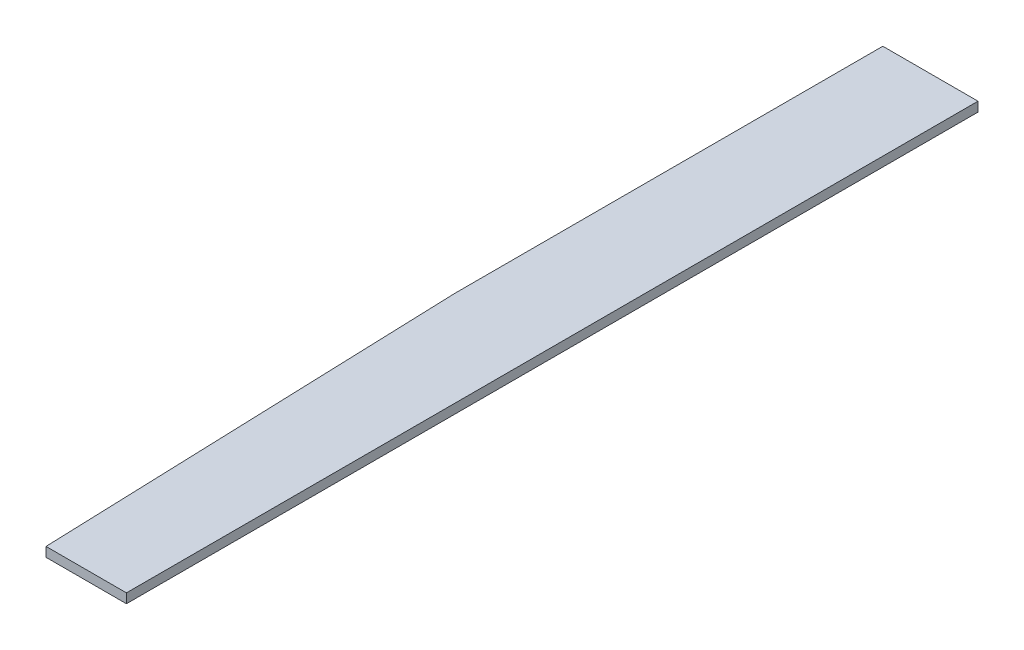
ISO-10303-21;
HEADER;
FILE_DESCRIPTION(('STEP AP214'),'2;1');
FILE_NAME('part.step','',(''),(''),'','','');
FILE_SCHEMA(('AUTOMOTIVE_DESIGN { 1 0 10303 214 1 1 1 1 }'));
ENDSEC;
DATA;
#1=APPLICATION_CONTEXT('core data for automotive mechanical design processes');
#2=APPLICATION_PROTOCOL_DEFINITION('international standard','automotive_design',2000,#1);
#3=PRODUCT_CONTEXT('',#1,'mechanical');
#4=PRODUCT('Part','Part','',(#3));
#5=PRODUCT_RELATED_PRODUCT_CATEGORY('part','',(#4));
#6=PRODUCT_DEFINITION_FORMATION('','',#4);
#7=PRODUCT_DEFINITION_CONTEXT('part definition',#1,'design');
#8=PRODUCT_DEFINITION('design','',#6,#7);
#9=PRODUCT_DEFINITION_SHAPE('','',#8);
#10=(LENGTH_UNIT() NAMED_UNIT(*) SI_UNIT(.MILLI.,.METRE.));
#11=(NAMED_UNIT(*) PLANE_ANGLE_UNIT() SI_UNIT($,.RADIAN.));
#12=(NAMED_UNIT(*) SI_UNIT($,.STERADIAN.) SOLID_ANGLE_UNIT());
#13=UNCERTAINTY_MEASURE_WITH_UNIT(LENGTH_MEASURE(1.E-05),#10,'distance_accuracy_value','');
#14=(GEOMETRIC_REPRESENTATION_CONTEXT(3) GLOBAL_UNCERTAINTY_ASSIGNED_CONTEXT((#13)) GLOBAL_UNIT_ASSIGNED_CONTEXT((#10,
#11,#12)) REPRESENTATION_CONTEXT('',''));
#15=CARTESIAN_POINT('',(0.,0.,0.));
#16=DIRECTION('',(0.,0.,1.));
#17=DIRECTION('',(1.,0.,0.));
#18=AXIS2_PLACEMENT_3D('',#15,#16,#17);
#19=CARTESIAN_POINT('',(0.,5.,0.));
#20=DIRECTION('',(-1.,0.,0.));
#21=DIRECTION('',(0.,0.,1.));
#22=AXIS2_PLACEMENT_3D('',#19,#20,#21);
#23=PLANE('',#22);
#24=DIRECTION('',(0.,0.,-1.));
#25=VECTOR('',#24,1.);
#26=CARTESIAN_POINT('',(0.,0.,0.));
#27=LINE('',#26,#25);
#28=CARTESIAN_POINT('',(0.,0.,0.));
#29=VERTEX_POINT('',#28);
#30=CARTESIAN_POINT('',(0.,0.,-450.));
#31=VERTEX_POINT('',#30);
#32=EDGE_CURVE('E124',#29,#31,#27,.T.);
#33=ORIENTED_EDGE('',*,*,#32,.T.);
#34=DIRECTION('',(0.,-1.,0.));
#35=VECTOR('',#34,1.);
#36=CARTESIAN_POINT('',(0.,5.,-450.));
#37=LINE('',#36,#35);
#38=CARTESIAN_POINT('',(0.,5.,-450.));
#39=VERTEX_POINT('',#38);
#40=EDGE_CURVE('E11',#39,#31,#37,.T.);
#41=ORIENTED_EDGE('',*,*,#40,.F.);
#42=DIRECTION('',(0.,0.,-1.));
#43=VECTOR('',#42,1.);
#44=CARTESIAN_POINT('',(0.,5.,0.));
#45=LINE('',#44,#43);
#46=CARTESIAN_POINT('',(0.,5.,0.));
#47=VERTEX_POINT('',#46);
#48=EDGE_CURVE('E137',#47,#39,#45,.T.);
#49=ORIENTED_EDGE('',*,*,#48,.F.);
#50=DIRECTION('',(0.,-1.,0.));
#51=VECTOR('',#50,1.);
#52=CARTESIAN_POINT('',(0.,5.,0.));
#53=LINE('',#52,#51);
#54=EDGE_CURVE('E120',#47,#29,#53,.T.);
#55=ORIENTED_EDGE('',*,*,#54,.T.);
#56=EDGE_LOOP('',(#33,#41,#49,#55));
#57=FACE_BOUND('',#56,.T.);
#58=ADVANCED_FACE('F45',(#57),#23,.F.);
#59=CARTESIAN_POINT('',(-50.3,5.,-450.));
#60=DIRECTION('',(0.,0.,1.));
#61=DIRECTION('',(1.,0.,0.));
#62=AXIS2_PLACEMENT_3D('',#59,#60,#61);
#63=PLANE('',#62);
#64=DIRECTION('',(-1.,0.,0.));
#65=VECTOR('',#64,1.);
#66=CARTESIAN_POINT('',(-50.3,0.,-450.));
#67=LINE('',#66,#65);
#68=CARTESIAN_POINT('',(-50.3,0.,-450.));
#69=VERTEX_POINT('',#68);
#70=EDGE_CURVE('E128',#31,#69,#67,.T.);
#71=ORIENTED_EDGE('',*,*,#70,.T.);
#72=DIRECTION('',(0.,-1.,0.));
#73=VECTOR('',#72,1.);
#74=CARTESIAN_POINT('',(-50.3,5.,-450.));
#75=LINE('',#74,#73);
#76=CARTESIAN_POINT('',(-50.3,5.,-450.));
#77=VERTEX_POINT('',#76);
#78=EDGE_CURVE('E54',#77,#69,#75,.T.);
#79=ORIENTED_EDGE('',*,*,#78,.F.);
#80=DIRECTION('',(-1.,0.,0.));
#81=VECTOR('',#80,1.);
#82=CARTESIAN_POINT('',(-50.3,5.,-450.));
#83=LINE('',#82,#81);
#84=EDGE_CURVE('E96',#39,#77,#83,.T.);
#85=ORIENTED_EDGE('',*,*,#84,.F.);
#86=ORIENTED_EDGE('',*,*,#40,.T.);
#87=EDGE_LOOP('',(#71,#79,#85,#86));
#88=FACE_BOUND('',#87,.T.);
#89=ADVANCED_FACE('F159',(#88),#63,.F.);
#90=CARTESIAN_POINT('',(-50.3,5.,-450.));
#91=DIRECTION('',(1.,0.,0.));
#92=DIRECTION('',(0.,0.,-1.));
#93=AXIS2_PLACEMENT_3D('',#90,#91,#92);
#94=PLANE('',#93);
#95=DIRECTION('',(0.,0.,1.));
#96=VECTOR('',#95,1.);
#97=CARTESIAN_POINT('',(-50.3,0.,-450.));
#98=LINE('',#97,#96);
#99=CARTESIAN_POINT('',(-50.3,0.,-223.782094102035));
#100=VERTEX_POINT('',#99);
#101=EDGE_CURVE('E112',#69,#100,#98,.T.);
#102=ORIENTED_EDGE('',*,*,#101,.T.);
#103=DIRECTION('',(0.,-1.,0.));
#104=VECTOR('',#103,1.);
#105=CARTESIAN_POINT('',(-50.3,5.,-223.782094102035));
#106=LINE('',#105,#104);
#107=CARTESIAN_POINT('',(-50.3,5.,-223.782094102035));
#108=VERTEX_POINT('',#107);
#109=EDGE_CURVE('E109',#108,#100,#106,.T.);
#110=ORIENTED_EDGE('',*,*,#109,.F.);
#111=DIRECTION('',(0.,0.,1.));
#112=VECTOR('',#111,1.);
#113=CARTESIAN_POINT('',(-50.3,5.,-450.));
#114=LINE('',#113,#112);
#115=EDGE_CURVE('E100',#77,#108,#114,.T.);
#116=ORIENTED_EDGE('',*,*,#115,.F.);
#117=ORIENTED_EDGE('',*,*,#78,.T.);
#118=EDGE_LOOP('',(#102,#110,#116,#117));
#119=FACE_BOUND('',#118,.T.);
#120=ADVANCED_FACE('F110',(#119),#94,.F.);
#121=CARTESIAN_POINT('',(-50.3,5.,-223.782094102035));
#122=DIRECTION('',(0.999393105717143,0.,-0.0348341821354097));
#123=DIRECTION('',(-0.0348341821354097,0.,-0.999393105717143));
#124=AXIS2_PLACEMENT_3D('',#121,#122,#123);
#125=PLANE('',#124);
#126=DIRECTION('',(0.0348341821354097,0.,0.999393105717143));
#127=VECTOR('',#126,1.);
#128=CARTESIAN_POINT('',(-50.3,0.,-223.782094102035));
#129=LINE('',#128,#127);
#130=CARTESIAN_POINT('',(-42.5,0.,0.));
#131=VERTEX_POINT('',#130);
#132=EDGE_CURVE('E82',#100,#131,#129,.T.);
#133=ORIENTED_EDGE('',*,*,#132,.T.);
#134=DIRECTION('',(0.,-1.,0.));
#135=VECTOR('',#134,1.);
#136=CARTESIAN_POINT('',(-42.5,5.,0.));
#137=LINE('',#136,#135);
#138=CARTESIAN_POINT('',(-42.5,5.,0.));
#139=VERTEX_POINT('',#138);
#140=EDGE_CURVE('E114',#139,#131,#137,.T.);
#141=ORIENTED_EDGE('',*,*,#140,.F.);
#142=DIRECTION('',(0.0348341821354097,0.,0.999393105717143));
#143=VECTOR('',#142,1.);
#144=CARTESIAN_POINT('',(-50.3,5.,-223.782094102035));
#145=LINE('',#144,#143);
#146=EDGE_CURVE('E104',#108,#139,#145,.T.);
#147=ORIENTED_EDGE('',*,*,#146,.F.);
#148=ORIENTED_EDGE('',*,*,#109,.T.);
#149=EDGE_LOOP('',(#133,#141,#147,#148));
#150=FACE_BOUND('',#149,.T.);
#151=ADVANCED_FACE('F116',(#150),#125,.F.);
#152=CARTESIAN_POINT('',(0.,5.,0.));
#153=DIRECTION('',(0.,0.,-1.));
#154=DIRECTION('',(-1.,0.,0.));
#155=AXIS2_PLACEMENT_3D('',#152,#153,#154);
#156=PLANE('',#155);
#157=DIRECTION('',(1.,0.,0.));
#158=VECTOR('',#157,1.);
#159=CARTESIAN_POINT('',(0.,0.,0.));
#160=LINE('',#159,#158);
#161=EDGE_CURVE('E88',#131,#29,#160,.T.);
#162=ORIENTED_EDGE('',*,*,#161,.T.);
#163=ORIENTED_EDGE('',*,*,#54,.F.);
#164=DIRECTION('',(1.,0.,0.));
#165=VECTOR('',#164,1.);
#166=CARTESIAN_POINT('',(0.,5.,0.));
#167=LINE('',#166,#165);
#168=EDGE_CURVE('E62',#139,#47,#167,.T.);
#169=ORIENTED_EDGE('',*,*,#168,.F.);
#170=ORIENTED_EDGE('',*,*,#140,.T.);
#171=EDGE_LOOP('',(#162,#163,#169,#170));
#172=FACE_BOUND('',#171,.T.);
#173=ADVANCED_FACE('F148',(#172),#156,.F.);
#174=CARTESIAN_POINT('',(0.,5.,0.));
#175=DIRECTION('',(0.,-1.,0.));
#176=DIRECTION('',(0.,0.,-1.));
#177=AXIS2_PLACEMENT_3D('',#174,#175,#176);
#178=PLANE('',#177);
#179=ORIENTED_EDGE('',*,*,#48,.T.);
#180=ORIENTED_EDGE('',*,*,#84,.T.);
#181=ORIENTED_EDGE('',*,*,#115,.T.);
#182=ORIENTED_EDGE('',*,*,#146,.T.);
#183=ORIENTED_EDGE('',*,*,#168,.T.);
#184=EDGE_LOOP('',(#179,#180,#181,#182,#183));
#185=FACE_BOUND('',#184,.T.);
#186=ADVANCED_FACE('F102',(#185),#178,.F.);
#187=CARTESIAN_POINT('',(0.,0.,0.));
#188=DIRECTION('',(0.,-1.,0.));
#189=DIRECTION('',(0.,0.,-1.));
#190=AXIS2_PLACEMENT_3D('',#187,#188,#189);
#191=PLANE('',#190);
#192=ORIENTED_EDGE('',*,*,#32,.F.);
#193=ORIENTED_EDGE('',*,*,#161,.F.);
#194=ORIENTED_EDGE('',*,*,#132,.F.);
#195=ORIENTED_EDGE('',*,*,#101,.F.);
#196=ORIENTED_EDGE('',*,*,#70,.F.);
#197=EDGE_LOOP('',(#192,#193,#194,#195,#196));
#198=FACE_BOUND('',#197,.T.);
#199=ADVANCED_FACE('F144',(#198),#191,.T.);
#200=CLOSED_SHELL('',(#58,#89,#120,#151,#173,#186,#199));
#201=MANIFOLD_SOLID_BREP('B2',#200);
#202=ADVANCED_BREP_SHAPE_REPRESENTATION('',(#18,#201),#14);
#203=SHAPE_DEFINITION_REPRESENTATION(#9,#202);
ENDSEC;
END-ISO-10303-21;
